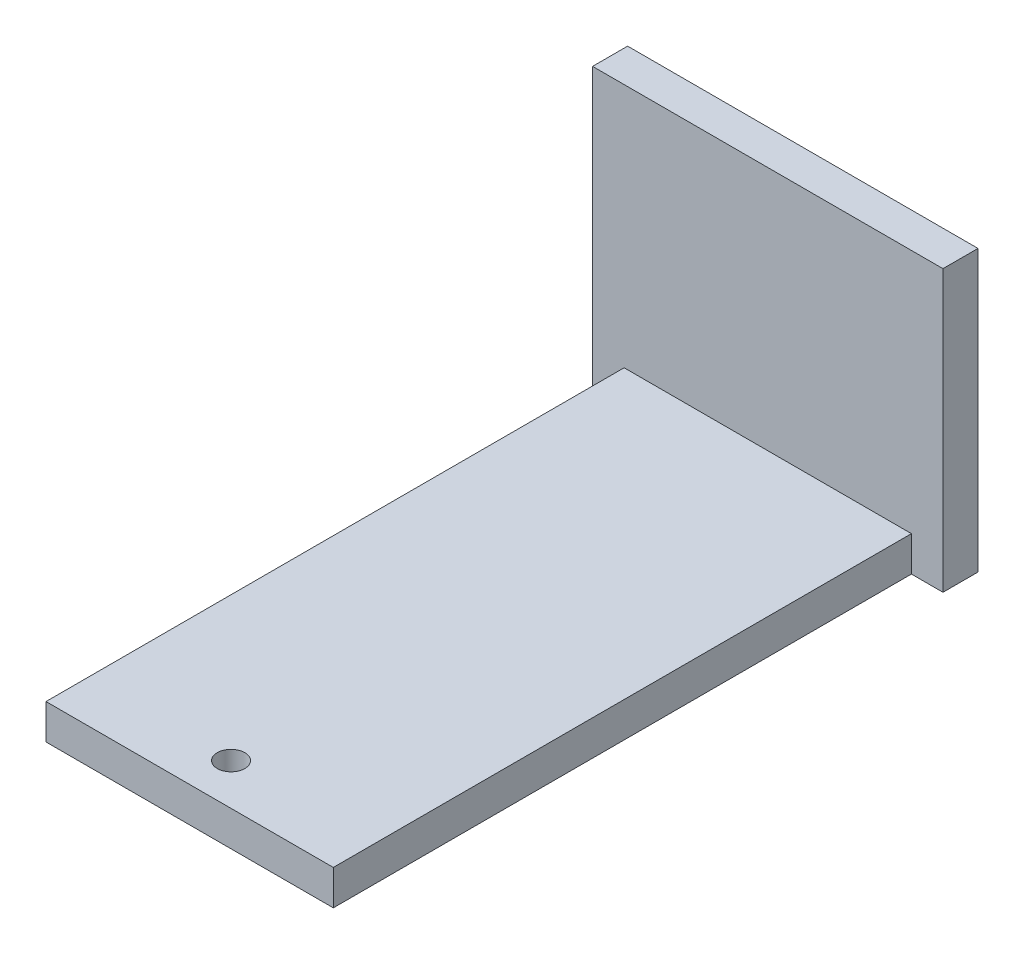
ISO-10303-21;
HEADER;
FILE_DESCRIPTION(('STEP AP214'),'2;1');
FILE_NAME('part.step','',(''),(''),'','','');
FILE_SCHEMA(('AUTOMOTIVE_DESIGN { 1 0 10303 214 1 1 1 1 }'));
ENDSEC;
DATA;
#1=APPLICATION_CONTEXT('core data for automotive mechanical design processes');
#2=APPLICATION_PROTOCOL_DEFINITION('international standard','automotive_design',2000,#1);
#3=PRODUCT_CONTEXT('',#1,'mechanical');
#4=PRODUCT('Part','Part','',(#3));
#5=PRODUCT_RELATED_PRODUCT_CATEGORY('part','',(#4));
#6=PRODUCT_DEFINITION_FORMATION('','',#4);
#7=PRODUCT_DEFINITION_CONTEXT('part definition',#1,'design');
#8=PRODUCT_DEFINITION('design','',#6,#7);
#9=PRODUCT_DEFINITION_SHAPE('','',#8);
#10=(LENGTH_UNIT() NAMED_UNIT(*) SI_UNIT(.MILLI.,.METRE.));
#11=(NAMED_UNIT(*) PLANE_ANGLE_UNIT() SI_UNIT($,.RADIAN.));
#12=(NAMED_UNIT(*) SI_UNIT($,.STERADIAN.) SOLID_ANGLE_UNIT());
#13=UNCERTAINTY_MEASURE_WITH_UNIT(LENGTH_MEASURE(1.E-05),#10,'distance_accuracy_value','');
#14=(GEOMETRIC_REPRESENTATION_CONTEXT(3) GLOBAL_UNCERTAINTY_ASSIGNED_CONTEXT((#13)) GLOBAL_UNIT_ASSIGNED_CONTEXT((#10,
#11,#12)) REPRESENTATION_CONTEXT('',''));
#15=CARTESIAN_POINT('',(0.,0.,0.));
#16=DIRECTION('',(0.,0.,1.));
#17=DIRECTION('',(1.,0.,0.));
#18=AXIS2_PLACEMENT_3D('',#15,#16,#17);
#19=CARTESIAN_POINT('',(0.,0.,2.54));
#20=DIRECTION('',(1.,0.,0.));
#21=DIRECTION('',(0.,1.,0.));
#22=AXIS2_PLACEMENT_3D('',#19,#20,#21);
#23=PLANE('',#22);
#24=DIRECTION('',(0.,-1.,0.));
#25=VECTOR('',#24,1.);
#26=CARTESIAN_POINT('',(0.,0.,0.));
#27=LINE('',#26,#25);
#28=CARTESIAN_POINT('',(0.,0.,0.));
#29=VERTEX_POINT('',#28);
#30=CARTESIAN_POINT('',(0.,-20.32,0.));
#31=VERTEX_POINT('',#30);
#32=EDGE_CURVE('E83',#29,#31,#27,.T.);
#33=ORIENTED_EDGE('',*,*,#32,.T.);
#34=DIRECTION('',(0.,0.,1.));
#35=VECTOR('',#34,1.);
#36=CARTESIAN_POINT('',(0.,-20.32,0.));
#37=LINE('',#36,#35);
#38=CARTESIAN_POINT('',(0.,-20.32,2.54));
#39=VERTEX_POINT('',#38);
#40=EDGE_CURVE('E49',#31,#39,#37,.T.);
#41=ORIENTED_EDGE('',*,*,#40,.T.);
#42=DIRECTION('',(0.,-1.,0.));
#43=VECTOR('',#42,1.);
#44=CARTESIAN_POINT('',(0.,0.,2.54));
#45=LINE('',#44,#43);
#46=CARTESIAN_POINT('',(0.,0.,2.54));
#47=VERTEX_POINT('',#46);
#48=EDGE_CURVE('E78',#47,#39,#45,.T.);
#49=ORIENTED_EDGE('',*,*,#48,.F.);
#50=DIRECTION('',(0.,0.,-1.));
#51=VECTOR('',#50,1.);
#52=CARTESIAN_POINT('',(0.,0.,2.54));
#53=LINE('',#52,#51);
#54=EDGE_CURVE('E42',#47,#29,#53,.T.);
#55=ORIENTED_EDGE('',*,*,#54,.T.);
#56=EDGE_LOOP('',(#33,#41,#49,#55));
#57=FACE_BOUND('',#56,.T.);
#58=ADVANCED_FACE('F35',(#57),#23,.F.);
#59=CARTESIAN_POINT('',(25.4,0.,2.54));
#60=DIRECTION('',(-1.,0.,0.));
#61=DIRECTION('',(0.,-1.,0.));
#62=AXIS2_PLACEMENT_3D('',#59,#60,#61);
#63=PLANE('',#62);
#64=DIRECTION('',(0.,1.,0.));
#65=VECTOR('',#64,1.);
#66=CARTESIAN_POINT('',(25.4,0.,2.54));
#67=LINE('',#66,#65);
#68=CARTESIAN_POINT('',(25.4,-20.32,2.54));
#69=VERTEX_POINT('',#68);
#70=CARTESIAN_POINT('',(25.4,0.,2.54));
#71=VERTEX_POINT('',#70);
#72=EDGE_CURVE('E94',#69,#71,#67,.T.);
#73=ORIENTED_EDGE('',*,*,#72,.F.);
#74=DIRECTION('',(0.,0.,1.));
#75=VECTOR('',#74,1.);
#76=CARTESIAN_POINT('',(25.4,-20.32,0.));
#77=LINE('',#76,#75);
#78=CARTESIAN_POINT('',(25.4,-20.32,0.));
#79=VERTEX_POINT('',#78);
#80=EDGE_CURVE('E130',#79,#69,#77,.T.);
#81=ORIENTED_EDGE('',*,*,#80,.F.);
#82=DIRECTION('',(0.,1.,0.));
#83=VECTOR('',#82,1.);
#84=CARTESIAN_POINT('',(25.4,0.,0.));
#85=LINE('',#84,#83);
#86=CARTESIAN_POINT('',(25.4,0.,0.));
#87=VERTEX_POINT('',#86);
#88=EDGE_CURVE('E79',#79,#87,#85,.T.);
#89=ORIENTED_EDGE('',*,*,#88,.T.);
#90=DIRECTION('',(0.,0.,-1.));
#91=VECTOR('',#90,1.);
#92=CARTESIAN_POINT('',(25.4,0.,2.54));
#93=LINE('',#92,#91);
#94=EDGE_CURVE('E11',#71,#87,#93,.T.);
#95=ORIENTED_EDGE('',*,*,#94,.F.);
#96=EDGE_LOOP('',(#73,#81,#89,#95));
#97=FACE_BOUND('',#96,.T.);
#98=ADVANCED_FACE('F187',(#97),#63,.F.);
#99=CARTESIAN_POINT('',(0.,0.,2.54));
#100=DIRECTION('',(0.,-1.,0.));
#101=DIRECTION('',(0.,0.,-1.));
#102=AXIS2_PLACEMENT_3D('',#99,#100,#101);
#103=PLANE('',#102);
#104=DIRECTION('',(-1.,0.,0.));
#105=VECTOR('',#104,1.);
#106=CARTESIAN_POINT('',(0.,0.,0.));
#107=LINE('',#106,#105);
#108=EDGE_CURVE('E70',#87,#29,#107,.T.);
#109=ORIENTED_EDGE('',*,*,#108,.T.);
#110=ORIENTED_EDGE('',*,*,#54,.F.);
#111=DIRECTION('',(-1.,0.,0.));
#112=VECTOR('',#111,1.);
#113=CARTESIAN_POINT('',(0.,0.,2.54));
#114=LINE('',#113,#112);
#115=EDGE_CURVE('E58',#71,#47,#114,.T.);
#116=ORIENTED_EDGE('',*,*,#115,.F.);
#117=ORIENTED_EDGE('',*,*,#94,.T.);
#118=EDGE_LOOP('',(#109,#110,#116,#117));
#119=FACE_BOUND('',#118,.T.);
#120=ADVANCED_FACE('F72',(#119),#103,.F.);
#121=CARTESIAN_POINT('',(0.,0.,2.54));
#122=DIRECTION('',(0.,0.,1.));
#123=DIRECTION('',(1.,0.,0.));
#124=AXIS2_PLACEMENT_3D('',#121,#122,#123);
#125=PLANE('',#124);
#126=DIRECTION('',(-1.,0.,0.));
#127=VECTOR('',#126,1.);
#128=CARTESIAN_POINT('',(0.,-20.32,2.54));
#129=LINE('',#128,#127);
#130=CARTESIAN_POINT('',(23.114,-20.32,2.54));
#131=VERTEX_POINT('',#130);
#132=EDGE_CURVE('E116',#69,#131,#129,.T.);
#133=ORIENTED_EDGE('',*,*,#132,.F.);
#134=ORIENTED_EDGE('',*,*,#72,.T.);
#135=ORIENTED_EDGE('',*,*,#115,.T.);
#136=ORIENTED_EDGE('',*,*,#48,.T.);
#137=CARTESIAN_POINT('',(2.286,-20.32,2.54));
#138=VERTEX_POINT('',#137);
#139=EDGE_CURVE('E129',#138,#39,#129,.T.);
#140=ORIENTED_EDGE('',*,*,#139,.F.);
#141=DIRECTION('',(0.,-1.,0.));
#142=VECTOR('',#141,1.);
#143=CARTESIAN_POINT('',(2.286,-17.78,2.54));
#144=LINE('',#143,#142);
#145=CARTESIAN_POINT('',(2.286,-17.78,2.54));
#146=VERTEX_POINT('',#145);
#147=EDGE_CURVE('E102',#146,#138,#144,.T.);
#148=ORIENTED_EDGE('',*,*,#147,.F.);
#149=DIRECTION('',(1.,0.,0.));
#150=VECTOR('',#149,1.);
#151=CARTESIAN_POINT('',(0.,-17.78,2.54));
#152=LINE('',#151,#150);
#153=CARTESIAN_POINT('',(23.114,-17.78,2.54));
#154=VERTEX_POINT('',#153);
#155=EDGE_CURVE('E105',#146,#154,#152,.T.);
#156=ORIENTED_EDGE('',*,*,#155,.T.);
#157=DIRECTION('',(0.,-1.,0.));
#158=VECTOR('',#157,1.);
#159=CARTESIAN_POINT('',(23.114,-17.78,2.54));
#160=LINE('',#159,#158);
#161=EDGE_CURVE('E99',#154,#131,#160,.T.);
#162=ORIENTED_EDGE('',*,*,#161,.T.);
#163=EDGE_LOOP('',(#133,#134,#135,#136,#140,#148,#156,#162));
#164=FACE_BOUND('',#163,.T.);
#165=ADVANCED_FACE('F163',(#164),#125,.T.);
#166=CARTESIAN_POINT('',(0.,0.,0.));
#167=DIRECTION('',(0.,0.,1.));
#168=DIRECTION('',(1.,0.,0.));
#169=AXIS2_PLACEMENT_3D('',#166,#167,#168);
#170=PLANE('',#169);
#171=ORIENTED_EDGE('',*,*,#88,.F.);
#172=DIRECTION('',(-1.,0.,0.));
#173=VECTOR('',#172,1.);
#174=CARTESIAN_POINT('',(0.,-20.32,0.));
#175=LINE('',#174,#173);
#176=EDGE_CURVE('E85',#79,#31,#175,.T.);
#177=ORIENTED_EDGE('',*,*,#176,.T.);
#178=ORIENTED_EDGE('',*,*,#32,.F.);
#179=ORIENTED_EDGE('',*,*,#108,.F.);
#180=EDGE_LOOP('',(#171,#177,#178,#179));
#181=FACE_BOUND('',#180,.T.);
#182=ADVANCED_FACE('F84',(#181),#170,.F.);
#183=CARTESIAN_POINT('',(2.286,-17.78,0.));
#184=DIRECTION('',(-1.,0.,0.));
#185=DIRECTION('',(0.,0.,1.));
#186=AXIS2_PLACEMENT_3D('',#183,#184,#185);
#187=PLANE('',#186);
#188=DIRECTION('',(0.,0.,-1.));
#189=VECTOR('',#188,1.);
#190=CARTESIAN_POINT('',(2.286,-20.32,0.));
#191=LINE('',#190,#189);
#192=CARTESIAN_POINT('',(2.286,-20.32,44.45));
#193=VERTEX_POINT('',#192);
#194=EDGE_CURVE('E113',#193,#138,#191,.T.);
#195=ORIENTED_EDGE('',*,*,#194,.F.);
#196=DIRECTION('',(0.,-1.,0.));
#197=VECTOR('',#196,1.);
#198=CARTESIAN_POINT('',(2.286,-17.78,44.45));
#199=LINE('',#198,#197);
#200=CARTESIAN_POINT('',(2.286,-17.78,44.45));
#201=VERTEX_POINT('',#200);
#202=EDGE_CURVE('E86',#201,#193,#199,.T.);
#203=ORIENTED_EDGE('',*,*,#202,.F.);
#204=DIRECTION('',(0.,0.,-1.));
#205=VECTOR('',#204,1.);
#206=CARTESIAN_POINT('',(2.286,-17.78,0.));
#207=LINE('',#206,#205);
#208=EDGE_CURVE('E109',#201,#146,#207,.T.);
#209=ORIENTED_EDGE('',*,*,#208,.T.);
#210=ORIENTED_EDGE('',*,*,#147,.T.);
#211=EDGE_LOOP('',(#195,#203,#209,#210));
#212=FACE_BOUND('',#211,.T.);
#213=ADVANCED_FACE('F159',(#212),#187,.T.);
#214=CARTESIAN_POINT('',(0.,-17.78,44.45));
#215=DIRECTION('',(0.,0.,-1.));
#216=DIRECTION('',(-1.,0.,0.));
#217=AXIS2_PLACEMENT_3D('',#214,#215,#216);
#218=PLANE('',#217);
#219=DIRECTION('',(1.,0.,0.));
#220=VECTOR('',#219,1.);
#221=CARTESIAN_POINT('',(0.,-20.32,44.45));
#222=LINE('',#221,#220);
#223=CARTESIAN_POINT('',(23.114,-20.32,44.45));
#224=VERTEX_POINT('',#223);
#225=EDGE_CURVE('E110',#193,#224,#222,.T.);
#226=ORIENTED_EDGE('',*,*,#225,.T.);
#227=DIRECTION('',(0.,-1.,0.));
#228=VECTOR('',#227,1.);
#229=CARTESIAN_POINT('',(23.114,-17.78,44.45));
#230=LINE('',#229,#228);
#231=CARTESIAN_POINT('',(23.114,-17.78,44.45));
#232=VERTEX_POINT('',#231);
#233=EDGE_CURVE('E90',#232,#224,#230,.T.);
#234=ORIENTED_EDGE('',*,*,#233,.F.);
#235=DIRECTION('',(1.,0.,0.));
#236=VECTOR('',#235,1.);
#237=CARTESIAN_POINT('',(0.,-17.78,44.45));
#238=LINE('',#237,#236);
#239=EDGE_CURVE('E122',#201,#232,#238,.T.);
#240=ORIENTED_EDGE('',*,*,#239,.F.);
#241=ORIENTED_EDGE('',*,*,#202,.T.);
#242=EDGE_LOOP('',(#226,#234,#240,#241));
#243=FACE_BOUND('',#242,.T.);
#244=ADVANCED_FACE('F192',(#243),#218,.F.);
#245=CARTESIAN_POINT('',(23.114,-17.78,0.));
#246=DIRECTION('',(1.,0.,0.));
#247=DIRECTION('',(0.,0.,-1.));
#248=AXIS2_PLACEMENT_3D('',#245,#246,#247);
#249=PLANE('',#248);
#250=DIRECTION('',(0.,0.,1.));
#251=VECTOR('',#250,1.);
#252=CARTESIAN_POINT('',(23.114,-20.32,0.));
#253=LINE('',#252,#251);
#254=EDGE_CURVE('E106',#131,#224,#253,.T.);
#255=ORIENTED_EDGE('',*,*,#254,.F.);
#256=ORIENTED_EDGE('',*,*,#161,.F.);
#257=DIRECTION('',(0.,0.,1.));
#258=VECTOR('',#257,1.);
#259=CARTESIAN_POINT('',(23.114,-17.78,0.));
#260=LINE('',#259,#258);
#261=EDGE_CURVE('E119',#154,#232,#260,.T.);
#262=ORIENTED_EDGE('',*,*,#261,.T.);
#263=ORIENTED_EDGE('',*,*,#233,.T.);
#264=EDGE_LOOP('',(#255,#256,#262,#263));
#265=FACE_BOUND('',#264,.T.);
#266=ADVANCED_FACE('F188',(#265),#249,.T.);
#267=CARTESIAN_POINT('',(0.,-17.78,0.));
#268=DIRECTION('',(0.,1.,0.));
#269=DIRECTION('',(0.,0.,1.));
#270=AXIS2_PLACEMENT_3D('',#267,#268,#269);
#271=PLANE('',#270);
#272=CARTESIAN_POINT('',(12.7,-17.78,41.45));
#273=DIRECTION('',(0.,1.,0.));
#274=DIRECTION('',(0.,0.,1.));
#275=AXIS2_PLACEMENT_3D('',#272,#273,#274);
#276=CIRCLE('',#275,1.);
#277=CARTESIAN_POINT('',(12.7,-17.78,42.45));
#278=VERTEX_POINT('',#277);
#279=EDGE_CURVE('E135',#278,#278,#276,.T.);
#280=ORIENTED_EDGE('',*,*,#279,.F.);
#281=EDGE_LOOP('',(#280));
#282=FACE_BOUND('',#281,.T.);
#283=ORIENTED_EDGE('',*,*,#208,.F.);
#284=ORIENTED_EDGE('',*,*,#239,.T.);
#285=ORIENTED_EDGE('',*,*,#261,.F.);
#286=ORIENTED_EDGE('',*,*,#155,.F.);
#287=EDGE_LOOP('',(#283,#284,#285,#286));
#288=FACE_BOUND('',#287,.T.);
#289=ADVANCED_FACE('F146',(#282,#288),#271,.T.);
#290=CARTESIAN_POINT('',(0.,-20.32,0.));
#291=DIRECTION('',(0.,1.,0.));
#292=DIRECTION('',(0.,0.,1.));
#293=AXIS2_PLACEMENT_3D('',#290,#291,#292);
#294=PLANE('',#293);
#295=CARTESIAN_POINT('',(12.7,-20.32,41.45));
#296=DIRECTION('',(0.,-1.,0.));
#297=DIRECTION('',(0.,0.,-1.));
#298=AXIS2_PLACEMENT_3D('',#295,#296,#297);
#299=CIRCLE('',#298,1.);
#300=CARTESIAN_POINT('',(12.7,-20.32,40.45));
#301=VERTEX_POINT('',#300);
#302=EDGE_CURVE('E138',#301,#301,#299,.T.);
#303=ORIENTED_EDGE('',*,*,#302,.F.);
#304=EDGE_LOOP('',(#303));
#305=FACE_BOUND('',#304,.T.);
#306=ORIENTED_EDGE('',*,*,#194,.T.);
#307=ORIENTED_EDGE('',*,*,#139,.T.);
#308=ORIENTED_EDGE('',*,*,#40,.F.);
#309=ORIENTED_EDGE('',*,*,#176,.F.);
#310=ORIENTED_EDGE('',*,*,#80,.T.);
#311=ORIENTED_EDGE('',*,*,#132,.T.);
#312=ORIENTED_EDGE('',*,*,#254,.T.);
#313=ORIENTED_EDGE('',*,*,#225,.F.);
#314=EDGE_LOOP('',(#306,#307,#308,#309,#310,#311,#312,#313));
#315=FACE_BOUND('',#314,.T.);
#316=ADVANCED_FACE('F144',(#305,#315),#294,.F.);
#317=CARTESIAN_POINT('',(12.7,0.,41.45));
#318=DIRECTION('',(0.,-1.,0.));
#319=DIRECTION('',(0.,0.,-1.));
#320=AXIS2_PLACEMENT_3D('',#317,#318,#319);
#321=CYLINDRICAL_SURFACE('',#320,1.);
#322=ORIENTED_EDGE('',*,*,#279,.T.);
#323=EDGE_LOOP('',(#322));
#324=FACE_BOUND('',#323,.T.);
#325=ORIENTED_EDGE('',*,*,#302,.T.);
#326=EDGE_LOOP('',(#325));
#327=FACE_BOUND('',#326,.T.);
#328=ADVANCED_FACE('F142',(#324,#327),#321,.F.);
#329=CLOSED_SHELL('',(#58,#98,#120,#165,#182,#213,#244,#266,#289,#316,#328));
#330=MANIFOLD_SOLID_BREP('B2',#329);
#331=ADVANCED_BREP_SHAPE_REPRESENTATION('',(#18,#330),#14);
#332=SHAPE_DEFINITION_REPRESENTATION(#9,#331);
ENDSEC;
END-ISO-10303-21;
